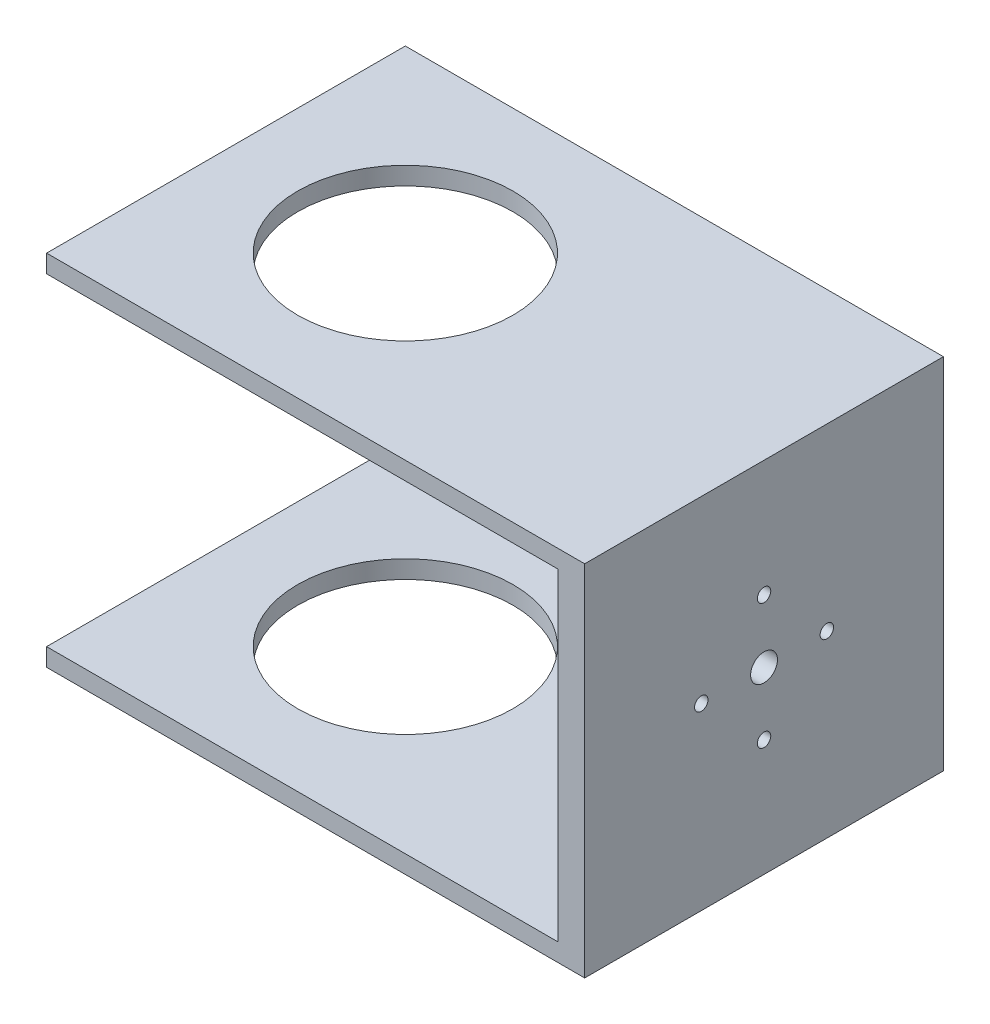
ISO-10303-21;
HEADER;
FILE_DESCRIPTION(('STEP AP214'),'2;1');
FILE_NAME('part.step','',(''),(''),'','','');
FILE_SCHEMA(('AUTOMOTIVE_DESIGN { 1 0 10303 214 1 1 1 1 }'));
ENDSEC;
DATA;
#1=APPLICATION_CONTEXT('core data for automotive mechanical design processes');
#2=APPLICATION_PROTOCOL_DEFINITION('international standard','automotive_design',2000,#1);
#3=PRODUCT_CONTEXT('',#1,'mechanical');
#4=PRODUCT('Part','Part','',(#3));
#5=PRODUCT_RELATED_PRODUCT_CATEGORY('part','',(#4));
#6=PRODUCT_DEFINITION_FORMATION('','',#4);
#7=PRODUCT_DEFINITION_CONTEXT('part definition',#1,'design');
#8=PRODUCT_DEFINITION('design','',#6,#7);
#9=PRODUCT_DEFINITION_SHAPE('','',#8);
#10=(LENGTH_UNIT() NAMED_UNIT(*) SI_UNIT(.MILLI.,.METRE.));
#11=(NAMED_UNIT(*) PLANE_ANGLE_UNIT() SI_UNIT($,.RADIAN.));
#12=(NAMED_UNIT(*) SI_UNIT($,.STERADIAN.) SOLID_ANGLE_UNIT());
#13=UNCERTAINTY_MEASURE_WITH_UNIT(LENGTH_MEASURE(1.E-05),#10,'distance_accuracy_value','');
#14=(GEOMETRIC_REPRESENTATION_CONTEXT(3) GLOBAL_UNCERTAINTY_ASSIGNED_CONTEXT((#13)) GLOBAL_UNIT_ASSIGNED_CONTEXT((#10,
#11,#12)) REPRESENTATION_CONTEXT('',''));
#15=CARTESIAN_POINT('',(0.,0.,0.));
#16=DIRECTION('',(0.,0.,1.));
#17=DIRECTION('',(1.,0.,0.));
#18=AXIS2_PLACEMENT_3D('',#15,#16,#17);
#19=CARTESIAN_POINT('',(0.,0.,40.));
#20=DIRECTION('',(1.,0.,0.));
#21=DIRECTION('',(0.,0.,-1.));
#22=AXIS2_PLACEMENT_3D('',#19,#20,#21);
#23=PLANE('',#22);
#24=DIRECTION('',(0.,-1.,0.));
#25=VECTOR('',#24,1.);
#26=CARTESIAN_POINT('',(0.,0.,0.));
#27=LINE('',#26,#25);
#28=CARTESIAN_POINT('',(0.,40.,0.));
#29=VERTEX_POINT('',#28);
#30=CARTESIAN_POINT('',(0.,38.,0.));
#31=VERTEX_POINT('',#30);
#32=EDGE_CURVE('E148',#29,#31,#27,.T.);
#33=ORIENTED_EDGE('',*,*,#32,.T.);
#34=DIRECTION('',(0.,0.,-1.));
#35=VECTOR('',#34,1.);
#36=CARTESIAN_POINT('',(0.,38.,0.));
#37=LINE('',#36,#35);
#38=CARTESIAN_POINT('',(0.,38.,40.));
#39=VERTEX_POINT('',#38);
#40=EDGE_CURVE('E128',#39,#31,#37,.T.);
#41=ORIENTED_EDGE('',*,*,#40,.F.);
#42=DIRECTION('',(0.,-1.,0.));
#43=VECTOR('',#42,1.);
#44=CARTESIAN_POINT('',(0.,0.,40.));
#45=LINE('',#44,#43);
#46=CARTESIAN_POINT('',(0.,40.,40.));
#47=VERTEX_POINT('',#46);
#48=EDGE_CURVE('E140',#47,#39,#45,.T.);
#49=ORIENTED_EDGE('',*,*,#48,.F.);
#50=DIRECTION('',(0.,0.,-1.));
#51=VECTOR('',#50,1.);
#52=CARTESIAN_POINT('',(0.,40.,40.));
#53=LINE('',#52,#51);
#54=EDGE_CURVE('E147',#47,#29,#53,.T.);
#55=ORIENTED_EDGE('',*,*,#54,.T.);
#56=EDGE_LOOP('',(#33,#41,#49,#55));
#57=FACE_BOUND('',#56,.T.);
#58=ADVANCED_FACE('F37',(#57),#23,.F.);
#59=CARTESIAN_POINT('',(0.,2.,40.));
#60=VERTEX_POINT('',#59);
#61=CARTESIAN_POINT('',(0.,0.,40.));
#62=VERTEX_POINT('',#61);
#63=EDGE_CURVE('E91',#60,#62,#45,.T.);
#64=ORIENTED_EDGE('',*,*,#63,.F.);
#65=DIRECTION('',(0.,0.,1.));
#66=VECTOR('',#65,1.);
#67=CARTESIAN_POINT('',(0.,2.,0.));
#68=LINE('',#67,#66);
#69=CARTESIAN_POINT('',(0.,2.,0.));
#70=VERTEX_POINT('',#69);
#71=EDGE_CURVE('E181',#70,#60,#68,.T.);
#72=ORIENTED_EDGE('',*,*,#71,.F.);
#73=CARTESIAN_POINT('',(0.,0.,0.));
#74=VERTEX_POINT('',#73);
#75=EDGE_CURVE('E133',#70,#74,#27,.T.);
#76=ORIENTED_EDGE('',*,*,#75,.T.);
#77=DIRECTION('',(0.,0.,-1.));
#78=VECTOR('',#77,1.);
#79=CARTESIAN_POINT('',(0.,0.,40.));
#80=LINE('',#79,#78);
#81=EDGE_CURVE('E11',#62,#74,#80,.T.);
#82=ORIENTED_EDGE('',*,*,#81,.F.);
#83=EDGE_LOOP('',(#64,#72,#76,#82));
#84=FACE_BOUND('',#83,.T.);
#85=ADVANCED_FACE('F39',(#84),#23,.F.);
#86=CARTESIAN_POINT('',(0.,0.,40.));
#87=DIRECTION('',(0.,1.,0.));
#88=DIRECTION('',(0.,0.,1.));
#89=AXIS2_PLACEMENT_3D('',#86,#87,#88);
#90=PLANE('',#89);
#91=CARTESIAN_POINT('',(20.,0.,20.));
#92=DIRECTION('',(0.,1.,0.));
#93=DIRECTION('',(0.,0.,1.));
#94=AXIS2_PLACEMENT_3D('',#91,#92,#93);
#95=CIRCLE('',#94,12.);
#96=CARTESIAN_POINT('',(20.,0.,32.));
#97=VERTEX_POINT('',#96);
#98=EDGE_CURVE('E274',#97,#97,#95,.T.);
#99=ORIENTED_EDGE('',*,*,#98,.T.);
#100=EDGE_LOOP('',(#99));
#101=FACE_BOUND('',#100,.T.);
#102=DIRECTION('',(1.,0.,0.));
#103=VECTOR('',#102,1.);
#104=CARTESIAN_POINT('',(0.,0.,0.));
#105=LINE('',#104,#103);
#106=CARTESIAN_POINT('',(60.,0.,0.));
#107=VERTEX_POINT('',#106);
#108=EDGE_CURVE('E151',#74,#107,#105,.T.);
#109=ORIENTED_EDGE('',*,*,#108,.T.);
#110=DIRECTION('',(0.,0.,-1.));
#111=VECTOR('',#110,1.);
#112=CARTESIAN_POINT('',(60.,0.,40.));
#113=LINE('',#112,#111);
#114=CARTESIAN_POINT('',(60.,0.,40.));
#115=VERTEX_POINT('',#114);
#116=EDGE_CURVE('E46',#115,#107,#113,.T.);
#117=ORIENTED_EDGE('',*,*,#116,.F.);
#118=DIRECTION('',(1.,0.,0.));
#119=VECTOR('',#118,1.);
#120=CARTESIAN_POINT('',(0.,0.,40.));
#121=LINE('',#120,#119);
#122=EDGE_CURVE('E142',#62,#115,#121,.T.);
#123=ORIENTED_EDGE('',*,*,#122,.F.);
#124=ORIENTED_EDGE('',*,*,#81,.T.);
#125=EDGE_LOOP('',(#109,#117,#123,#124));
#126=FACE_BOUND('',#125,.T.);
#127=ADVANCED_FACE('F213',(#101,#126),#90,.F.);
#128=CARTESIAN_POINT('',(60.,0.,40.));
#129=DIRECTION('',(-1.,0.,0.));
#130=DIRECTION('',(0.,0.,1.));
#131=AXIS2_PLACEMENT_3D('',#128,#129,#130);
#132=PLANE('',#131);
#133=CARTESIAN_POINT('',(60.,27.,20.));
#134=DIRECTION('',(1.,0.,0.));
#135=DIRECTION('',(0.,0.,-1.));
#136=AXIS2_PLACEMENT_3D('',#133,#134,#135);
#137=CIRCLE('',#136,0.750000000000002);
#138=CARTESIAN_POINT('',(60.,27.,19.25));
#139=VERTEX_POINT('',#138);
#140=EDGE_CURVE('E165',#139,#139,#137,.T.);
#141=ORIENTED_EDGE('',*,*,#140,.F.);
#142=EDGE_LOOP('',(#141));
#143=FACE_BOUND('',#142,.T.);
#144=CARTESIAN_POINT('',(60.,20.,13.));
#145=DIRECTION('',(1.,0.,0.));
#146=DIRECTION('',(0.,0.,-1.));
#147=AXIS2_PLACEMENT_3D('',#144,#145,#146);
#148=CIRCLE('',#147,0.750000000000001);
#149=CARTESIAN_POINT('',(60.,20.,12.25));
#150=VERTEX_POINT('',#149);
#151=EDGE_CURVE('E237',#150,#150,#148,.T.);
#152=ORIENTED_EDGE('',*,*,#151,.F.);
#153=EDGE_LOOP('',(#152));
#154=FACE_BOUND('',#153,.T.);
#155=CARTESIAN_POINT('',(60.,13.,20.));
#156=DIRECTION('',(1.,0.,0.));
#157=DIRECTION('',(0.,0.,-1.));
#158=AXIS2_PLACEMENT_3D('',#155,#156,#157);
#159=CIRCLE('',#158,0.750000000000061);
#160=CARTESIAN_POINT('',(60.,13.,19.2499999999999));
#161=VERTEX_POINT('',#160);
#162=EDGE_CURVE('E241',#161,#161,#159,.T.);
#163=ORIENTED_EDGE('',*,*,#162,.F.);
#164=EDGE_LOOP('',(#163));
#165=FACE_BOUND('',#164,.T.);
#166=CARTESIAN_POINT('',(60.,20.,27.));
#167=DIRECTION('',(1.,0.,0.));
#168=DIRECTION('',(0.,0.,-1.));
#169=AXIS2_PLACEMENT_3D('',#166,#167,#168);
#170=CIRCLE('',#169,0.750000000000087);
#171=CARTESIAN_POINT('',(60.,20.,26.2499999999999));
#172=VERTEX_POINT('',#171);
#173=EDGE_CURVE('E245',#172,#172,#170,.T.);
#174=ORIENTED_EDGE('',*,*,#173,.F.);
#175=EDGE_LOOP('',(#174));
#176=FACE_BOUND('',#175,.T.);
#177=CARTESIAN_POINT('',(60.,20.,20.));
#178=DIRECTION('',(1.,0.,0.));
#179=DIRECTION('',(0.,0.,-1.));
#180=AXIS2_PLACEMENT_3D('',#177,#178,#179);
#181=CIRCLE('',#180,1.5);
#182=CARTESIAN_POINT('',(60.,20.,18.5));
#183=VERTEX_POINT('',#182);
#184=EDGE_CURVE('E176',#183,#183,#181,.T.);
#185=ORIENTED_EDGE('',*,*,#184,.F.);
#186=EDGE_LOOP('',(#185));
#187=FACE_BOUND('',#186,.T.);
#188=DIRECTION('',(0.,1.,0.));
#189=VECTOR('',#188,1.);
#190=CARTESIAN_POINT('',(60.,0.,0.));
#191=LINE('',#190,#189);
#192=CARTESIAN_POINT('',(60.,40.,0.));
#193=VERTEX_POINT('',#192);
#194=EDGE_CURVE('E153',#107,#193,#191,.T.);
#195=ORIENTED_EDGE('',*,*,#194,.T.);
#196=DIRECTION('',(0.,0.,-1.));
#197=VECTOR('',#196,1.);
#198=CARTESIAN_POINT('',(60.,40.,40.));
#199=LINE('',#198,#197);
#200=CARTESIAN_POINT('',(60.,40.,40.));
#201=VERTEX_POINT('',#200);
#202=EDGE_CURVE('E157',#201,#193,#199,.T.);
#203=ORIENTED_EDGE('',*,*,#202,.F.);
#204=DIRECTION('',(0.,1.,0.));
#205=VECTOR('',#204,1.);
#206=CARTESIAN_POINT('',(60.,0.,40.));
#207=LINE('',#206,#205);
#208=EDGE_CURVE('E144',#115,#201,#207,.T.);
#209=ORIENTED_EDGE('',*,*,#208,.F.);
#210=ORIENTED_EDGE('',*,*,#116,.T.);
#211=EDGE_LOOP('',(#195,#203,#209,#210));
#212=FACE_BOUND('',#211,.T.);
#213=ADVANCED_FACE('F205',(#143,#154,#165,#176,#187,#212),#132,.F.);
#214=CARTESIAN_POINT('',(0.,40.,40.));
#215=DIRECTION('',(0.,-1.,0.));
#216=DIRECTION('',(0.,0.,-1.));
#217=AXIS2_PLACEMENT_3D('',#214,#215,#216);
#218=PLANE('',#217);
#219=CARTESIAN_POINT('',(20.,40.,20.));
#220=DIRECTION('',(0.,1.,0.));
#221=DIRECTION('',(0.,0.,1.));
#222=AXIS2_PLACEMENT_3D('',#219,#220,#221);
#223=CIRCLE('',#222,12.);
#224=CARTESIAN_POINT('',(20.,40.,32.));
#225=VERTEX_POINT('',#224);
#226=EDGE_CURVE('E278',#225,#225,#223,.T.);
#227=ORIENTED_EDGE('',*,*,#226,.F.);
#228=EDGE_LOOP('',(#227));
#229=FACE_BOUND('',#228,.T.);
#230=DIRECTION('',(-1.,0.,0.));
#231=VECTOR('',#230,1.);
#232=CARTESIAN_POINT('',(0.,40.,0.));
#233=LINE('',#232,#231);
#234=EDGE_CURVE('E84',#193,#29,#233,.T.);
#235=ORIENTED_EDGE('',*,*,#234,.T.);
#236=ORIENTED_EDGE('',*,*,#54,.F.);
#237=DIRECTION('',(-1.,0.,0.));
#238=VECTOR('',#237,1.);
#239=CARTESIAN_POINT('',(0.,40.,40.));
#240=LINE('',#239,#238);
#241=EDGE_CURVE('E63',#201,#47,#240,.T.);
#242=ORIENTED_EDGE('',*,*,#241,.F.);
#243=ORIENTED_EDGE('',*,*,#202,.T.);
#244=EDGE_LOOP('',(#235,#236,#242,#243));
#245=FACE_BOUND('',#244,.T.);
#246=ADVANCED_FACE('F198',(#229,#245),#218,.F.);
#247=CARTESIAN_POINT('',(0.,0.,40.));
#248=DIRECTION('',(0.,0.,-1.));
#249=DIRECTION('',(-1.,0.,0.));
#250=AXIS2_PLACEMENT_3D('',#247,#248,#249);
#251=PLANE('',#250);
#252=ORIENTED_EDGE('',*,*,#48,.T.);
#253=DIRECTION('',(-1.,0.,0.));
#254=VECTOR('',#253,1.);
#255=CARTESIAN_POINT('',(57.,38.,40.));
#256=LINE('',#255,#254);
#257=CARTESIAN_POINT('',(57.,38.,40.));
#258=VERTEX_POINT('',#257);
#259=EDGE_CURVE('E135',#258,#39,#256,.T.);
#260=ORIENTED_EDGE('',*,*,#259,.F.);
#261=DIRECTION('',(0.,1.,0.));
#262=VECTOR('',#261,1.);
#263=CARTESIAN_POINT('',(57.,38.,40.));
#264=LINE('',#263,#262);
#265=CARTESIAN_POINT('',(57.,2.,40.));
#266=VERTEX_POINT('',#265);
#267=EDGE_CURVE('E121',#266,#258,#264,.T.);
#268=ORIENTED_EDGE('',*,*,#267,.F.);
#269=DIRECTION('',(-1.,0.,0.));
#270=VECTOR('',#269,1.);
#271=CARTESIAN_POINT('',(57.,2.,40.));
#272=LINE('',#271,#270);
#273=EDGE_CURVE('E119',#266,#60,#272,.T.);
#274=ORIENTED_EDGE('',*,*,#273,.T.);
#275=ORIENTED_EDGE('',*,*,#63,.T.);
#276=ORIENTED_EDGE('',*,*,#122,.T.);
#277=ORIENTED_EDGE('',*,*,#208,.T.);
#278=ORIENTED_EDGE('',*,*,#241,.T.);
#279=EDGE_LOOP('',(#252,#260,#268,#274,#275,#276,#277,#278));
#280=FACE_BOUND('',#279,.T.);
#281=ADVANCED_FACE('F196',(#280),#251,.F.);
#282=CARTESIAN_POINT('',(0.,0.,0.));
#283=DIRECTION('',(0.,0.,-1.));
#284=DIRECTION('',(-1.,0.,0.));
#285=AXIS2_PLACEMENT_3D('',#282,#283,#284);
#286=PLANE('',#285);
#287=DIRECTION('',(-1.,0.,0.));
#288=VECTOR('',#287,1.);
#289=CARTESIAN_POINT('',(57.,38.,0.));
#290=LINE('',#289,#288);
#291=CARTESIAN_POINT('',(57.,38.,0.));
#292=VERTEX_POINT('',#291);
#293=EDGE_CURVE('E188',#292,#31,#290,.T.);
#294=ORIENTED_EDGE('',*,*,#293,.T.);
#295=ORIENTED_EDGE('',*,*,#32,.F.);
#296=ORIENTED_EDGE('',*,*,#234,.F.);
#297=ORIENTED_EDGE('',*,*,#194,.F.);
#298=ORIENTED_EDGE('',*,*,#108,.F.);
#299=ORIENTED_EDGE('',*,*,#75,.F.);
#300=DIRECTION('',(-1.,0.,0.));
#301=VECTOR('',#300,1.);
#302=CARTESIAN_POINT('',(57.,2.,0.));
#303=LINE('',#302,#301);
#304=CARTESIAN_POINT('',(57.,2.,0.));
#305=VERTEX_POINT('',#304);
#306=EDGE_CURVE('E117',#305,#70,#303,.T.);
#307=ORIENTED_EDGE('',*,*,#306,.F.);
#308=DIRECTION('',(0.,-1.,0.));
#309=VECTOR('',#308,1.);
#310=CARTESIAN_POINT('',(57.,38.,0.));
#311=LINE('',#310,#309);
#312=EDGE_CURVE('E122',#292,#305,#311,.T.);
#313=ORIENTED_EDGE('',*,*,#312,.F.);
#314=EDGE_LOOP('',(#294,#295,#296,#297,#298,#299,#307,#313));
#315=FACE_BOUND('',#314,.T.);
#316=ADVANCED_FACE('F131',(#315),#286,.T.);
#317=CARTESIAN_POINT('',(57.,38.,0.));
#318=DIRECTION('',(0.,1.,0.));
#319=DIRECTION('',(0.,0.,1.));
#320=AXIS2_PLACEMENT_3D('',#317,#318,#319);
#321=PLANE('',#320);
#322=CARTESIAN_POINT('',(20.,38.,20.));
#323=DIRECTION('',(0.,1.,0.));
#324=DIRECTION('',(0.,0.,1.));
#325=AXIS2_PLACEMENT_3D('',#322,#323,#324);
#326=CIRCLE('',#325,12.);
#327=CARTESIAN_POINT('',(20.,38.,32.));
#328=VERTEX_POINT('',#327);
#329=EDGE_CURVE('E273',#328,#328,#326,.T.);
#330=ORIENTED_EDGE('',*,*,#329,.T.);
#331=EDGE_LOOP('',(#330));
#332=FACE_BOUND('',#331,.T.);
#333=ORIENTED_EDGE('',*,*,#40,.T.);
#334=ORIENTED_EDGE('',*,*,#293,.F.);
#335=DIRECTION('',(0.,0.,-1.));
#336=VECTOR('',#335,1.);
#337=CARTESIAN_POINT('',(57.,38.,0.));
#338=LINE('',#337,#336);
#339=EDGE_CURVE('E54',#258,#292,#338,.T.);
#340=ORIENTED_EDGE('',*,*,#339,.F.);
#341=ORIENTED_EDGE('',*,*,#259,.T.);
#342=EDGE_LOOP('',(#333,#334,#340,#341));
#343=FACE_BOUND('',#342,.T.);
#344=ADVANCED_FACE('F192',(#332,#343),#321,.F.);
#345=CARTESIAN_POINT('',(57.,2.,0.));
#346=DIRECTION('',(0.,-1.,0.));
#347=DIRECTION('',(0.,0.,-1.));
#348=AXIS2_PLACEMENT_3D('',#345,#346,#347);
#349=PLANE('',#348);
#350=CARTESIAN_POINT('',(20.,2.,20.));
#351=DIRECTION('',(0.,-1.,0.));
#352=DIRECTION('',(0.,0.,-1.));
#353=AXIS2_PLACEMENT_3D('',#350,#351,#352);
#354=CIRCLE('',#353,12.);
#355=CARTESIAN_POINT('',(20.,2.,7.99999999999999));
#356=VERTEX_POINT('',#355);
#357=EDGE_CURVE('E41',#356,#356,#354,.T.);
#358=ORIENTED_EDGE('',*,*,#357,.T.);
#359=EDGE_LOOP('',(#358));
#360=FACE_BOUND('',#359,.T.);
#361=ORIENTED_EDGE('',*,*,#71,.T.);
#362=ORIENTED_EDGE('',*,*,#273,.F.);
#363=DIRECTION('',(0.,0.,1.));
#364=VECTOR('',#363,1.);
#365=CARTESIAN_POINT('',(57.,2.,0.));
#366=LINE('',#365,#364);
#367=EDGE_CURVE('E114',#305,#266,#366,.T.);
#368=ORIENTED_EDGE('',*,*,#367,.F.);
#369=ORIENTED_EDGE('',*,*,#306,.T.);
#370=EDGE_LOOP('',(#361,#362,#368,#369));
#371=FACE_BOUND('',#370,.T.);
#372=ADVANCED_FACE('F115',(#360,#371),#349,.F.);
#373=CARTESIAN_POINT('',(57.,0.,0.));
#374=DIRECTION('',(-1.,0.,0.));
#375=DIRECTION('',(0.,0.,1.));
#376=AXIS2_PLACEMENT_3D('',#373,#374,#375);
#377=PLANE('',#376);
#378=CARTESIAN_POINT('',(57.,27.,20.));
#379=DIRECTION('',(-1.,0.,0.));
#380=DIRECTION('',(0.,0.,1.));
#381=AXIS2_PLACEMENT_3D('',#378,#379,#380);
#382=CIRCLE('',#381,0.750000000000002);
#383=CARTESIAN_POINT('',(57.,27.,20.75));
#384=VERTEX_POINT('',#383);
#385=EDGE_CURVE('E170',#384,#384,#382,.T.);
#386=ORIENTED_EDGE('',*,*,#385,.F.);
#387=EDGE_LOOP('',(#386));
#388=FACE_BOUND('',#387,.T.);
#389=CARTESIAN_POINT('',(57.,20.,13.));
#390=DIRECTION('',(-1.,0.,0.));
#391=DIRECTION('',(0.,0.,1.));
#392=AXIS2_PLACEMENT_3D('',#389,#390,#391);
#393=CIRCLE('',#392,0.750000000000001);
#394=CARTESIAN_POINT('',(57.,20.,13.75));
#395=VERTEX_POINT('',#394);
#396=EDGE_CURVE('E168',#395,#395,#393,.T.);
#397=ORIENTED_EDGE('',*,*,#396,.F.);
#398=EDGE_LOOP('',(#397));
#399=FACE_BOUND('',#398,.T.);
#400=CARTESIAN_POINT('',(57.,13.,20.));
#401=DIRECTION('',(-1.,0.,0.));
#402=DIRECTION('',(0.,0.,1.));
#403=AXIS2_PLACEMENT_3D('',#400,#401,#402);
#404=CIRCLE('',#403,0.750000000000061);
#405=CARTESIAN_POINT('',(57.,13.,20.75));
#406=VERTEX_POINT('',#405);
#407=EDGE_CURVE('E164',#406,#406,#404,.T.);
#408=ORIENTED_EDGE('',*,*,#407,.F.);
#409=EDGE_LOOP('',(#408));
#410=FACE_BOUND('',#409,.T.);
#411=CARTESIAN_POINT('',(57.,20.,27.));
#412=DIRECTION('',(-1.,0.,0.));
#413=DIRECTION('',(0.,0.,1.));
#414=AXIS2_PLACEMENT_3D('',#411,#412,#413);
#415=CIRCLE('',#414,0.750000000000087);
#416=CARTESIAN_POINT('',(57.,20.,27.7500000000001));
#417=VERTEX_POINT('',#416);
#418=EDGE_CURVE('E161',#417,#417,#415,.T.);
#419=ORIENTED_EDGE('',*,*,#418,.F.);
#420=EDGE_LOOP('',(#419));
#421=FACE_BOUND('',#420,.T.);
#422=CARTESIAN_POINT('',(57.,20.,20.));
#423=DIRECTION('',(-1.,0.,0.));
#424=DIRECTION('',(0.,0.,1.));
#425=AXIS2_PLACEMENT_3D('',#422,#423,#424);
#426=CIRCLE('',#425,1.5);
#427=CARTESIAN_POINT('',(57.,20.,21.5));
#428=VERTEX_POINT('',#427);
#429=EDGE_CURVE('E172',#428,#428,#426,.F.);
#430=ORIENTED_EDGE('',*,*,#429,.T.);
#431=EDGE_LOOP('',(#430));
#432=FACE_BOUND('',#431,.T.);
#433=ORIENTED_EDGE('',*,*,#312,.T.);
#434=ORIENTED_EDGE('',*,*,#367,.T.);
#435=ORIENTED_EDGE('',*,*,#267,.T.);
#436=ORIENTED_EDGE('',*,*,#339,.T.);
#437=EDGE_LOOP('',(#433,#434,#435,#436));
#438=FACE_BOUND('',#437,.T.);
#439=ADVANCED_FACE('F125',(#388,#399,#410,#421,#432,#438),#377,.T.);
#440=CARTESIAN_POINT('',(-0.001000000000001,20.,20.));
#441=DIRECTION('',(1.,0.,0.));
#442=DIRECTION('',(0.,0.,-1.));
#443=AXIS2_PLACEMENT_3D('',#440,#441,#442);
#444=CYLINDRICAL_SURFACE('',#443,1.5);
#445=ORIENTED_EDGE('',*,*,#429,.F.);
#446=EDGE_LOOP('',(#445));
#447=FACE_BOUND('',#446,.T.);
#448=ORIENTED_EDGE('',*,*,#184,.T.);
#449=EDGE_LOOP('',(#448));
#450=FACE_BOUND('',#449,.T.);
#451=ADVANCED_FACE('F248',(#447,#450),#444,.F.);
#452=CARTESIAN_POINT('',(22.,20.,27.));
#453=DIRECTION('',(1.,0.,0.));
#454=DIRECTION('',(0.,0.,-1.));
#455=AXIS2_PLACEMENT_3D('',#452,#453,#454);
#456=CYLINDRICAL_SURFACE('',#455,0.750000000000087);
#457=ORIENTED_EDGE('',*,*,#418,.T.);
#458=EDGE_LOOP('',(#457));
#459=FACE_BOUND('',#458,.T.);
#460=ORIENTED_EDGE('',*,*,#173,.T.);
#461=EDGE_LOOP('',(#460));
#462=FACE_BOUND('',#461,.T.);
#463=ADVANCED_FACE('F250',(#459,#462),#456,.F.);
#464=CARTESIAN_POINT('',(22.,13.,20.));
#465=DIRECTION('',(1.,0.,0.));
#466=DIRECTION('',(0.,0.,-1.));
#467=AXIS2_PLACEMENT_3D('',#464,#465,#466);
#468=CYLINDRICAL_SURFACE('',#467,0.750000000000061);
#469=ORIENTED_EDGE('',*,*,#407,.T.);
#470=EDGE_LOOP('',(#469));
#471=FACE_BOUND('',#470,.T.);
#472=ORIENTED_EDGE('',*,*,#162,.T.);
#473=EDGE_LOOP('',(#472));
#474=FACE_BOUND('',#473,.T.);
#475=ADVANCED_FACE('F257',(#471,#474),#468,.F.);
#476=CARTESIAN_POINT('',(22.,20.,13.));
#477=DIRECTION('',(1.,0.,0.));
#478=DIRECTION('',(0.,0.,-1.));
#479=AXIS2_PLACEMENT_3D('',#476,#477,#478);
#480=CYLINDRICAL_SURFACE('',#479,0.750000000000001);
#481=ORIENTED_EDGE('',*,*,#396,.T.);
#482=EDGE_LOOP('',(#481));
#483=FACE_BOUND('',#482,.T.);
#484=ORIENTED_EDGE('',*,*,#151,.T.);
#485=EDGE_LOOP('',(#484));
#486=FACE_BOUND('',#485,.T.);
#487=ADVANCED_FACE('F289',(#483,#486),#480,.F.);
#488=CARTESIAN_POINT('',(22.,27.,20.));
#489=DIRECTION('',(1.,0.,0.));
#490=DIRECTION('',(0.,0.,-1.));
#491=AXIS2_PLACEMENT_3D('',#488,#489,#490);
#492=CYLINDRICAL_SURFACE('',#491,0.750000000000002);
#493=ORIENTED_EDGE('',*,*,#385,.T.);
#494=EDGE_LOOP('',(#493));
#495=FACE_BOUND('',#494,.T.);
#496=ORIENTED_EDGE('',*,*,#140,.T.);
#497=EDGE_LOOP('',(#496));
#498=FACE_BOUND('',#497,.T.);
#499=ADVANCED_FACE('F294',(#495,#498),#492,.F.);
#500=CARTESIAN_POINT('',(20.,0.,20.));
#501=DIRECTION('',(0.,1.,0.));
#502=DIRECTION('',(0.,0.,1.));
#503=AXIS2_PLACEMENT_3D('',#500,#501,#502);
#504=CYLINDRICAL_SURFACE('',#503,12.);
#505=ORIENTED_EDGE('',*,*,#98,.F.);
#506=EDGE_LOOP('',(#505));
#507=FACE_BOUND('',#506,.T.);
#508=ORIENTED_EDGE('',*,*,#357,.F.);
#509=EDGE_LOOP('',(#508));
#510=FACE_BOUND('',#509,.T.);
#511=ADVANCED_FACE('F300',(#507,#510),#504,.F.);
#512=ORIENTED_EDGE('',*,*,#226,.T.);
#513=EDGE_LOOP('',(#512));
#514=FACE_BOUND('',#513,.T.);
#515=ORIENTED_EDGE('',*,*,#329,.F.);
#516=EDGE_LOOP('',(#515));
#517=FACE_BOUND('',#516,.T.);
#518=ADVANCED_FACE('F301',(#514,#517),#504,.F.);
#519=CLOSED_SHELL('',(#58,#85,#127,#213,#246,#281,#316,#344,#372,#439,#451,#463,#475,#487,#499,
#511,#518));
#520=MANIFOLD_SOLID_BREP('B2',#519);
#521=ADVANCED_BREP_SHAPE_REPRESENTATION('',(#18,#520),#14);
#522=SHAPE_DEFINITION_REPRESENTATION(#9,#521);
ENDSEC;
END-ISO-10303-21;
